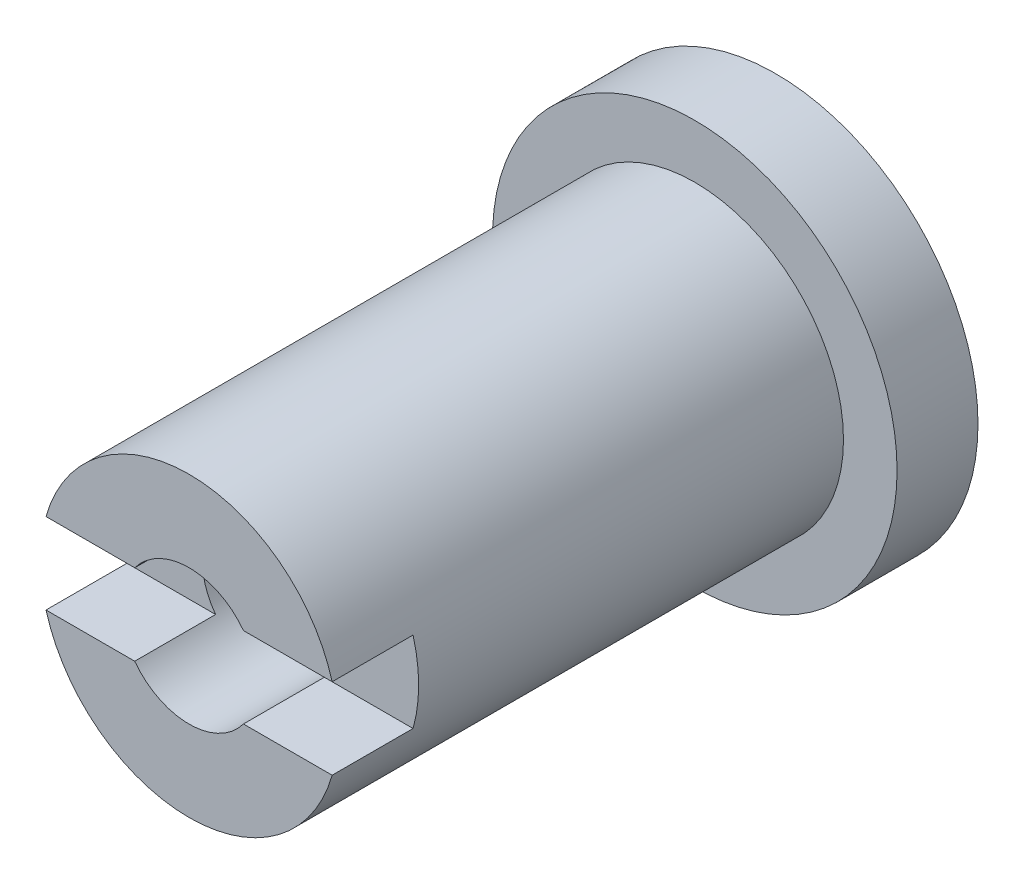
ISO-10303-21;
HEADER;
FILE_DESCRIPTION(('STEP AP214'),'2;1');
FILE_NAME('part.step','',(''),(''),'','','');
FILE_SCHEMA(('AUTOMOTIVE_DESIGN { 1 0 10303 214 1 1 1 1 }'));
ENDSEC;
DATA;
#1=APPLICATION_CONTEXT('core data for automotive mechanical design processes');
#2=APPLICATION_PROTOCOL_DEFINITION('international standard','automotive_design',2000,#1);
#3=PRODUCT_CONTEXT('',#1,'mechanical');
#4=PRODUCT('Part','Part','',(#3));
#5=PRODUCT_RELATED_PRODUCT_CATEGORY('part','',(#4));
#6=PRODUCT_DEFINITION_FORMATION('','',#4);
#7=PRODUCT_DEFINITION_CONTEXT('part definition',#1,'design');
#8=PRODUCT_DEFINITION('design','',#6,#7);
#9=PRODUCT_DEFINITION_SHAPE('','',#8);
#10=(LENGTH_UNIT() NAMED_UNIT(*) SI_UNIT(.MILLI.,.METRE.));
#11=(NAMED_UNIT(*) PLANE_ANGLE_UNIT() SI_UNIT($,.RADIAN.));
#12=(NAMED_UNIT(*) SI_UNIT($,.STERADIAN.) SOLID_ANGLE_UNIT());
#13=UNCERTAINTY_MEASURE_WITH_UNIT(LENGTH_MEASURE(1.E-05),#10,'distance_accuracy_value','');
#14=(GEOMETRIC_REPRESENTATION_CONTEXT(3) GLOBAL_UNCERTAINTY_ASSIGNED_CONTEXT((#13)) GLOBAL_UNIT_ASSIGNED_CONTEXT((#10,
#11,#12)) REPRESENTATION_CONTEXT('',''));
#15=CARTESIAN_POINT('',(0.,0.,0.));
#16=DIRECTION('',(0.,0.,1.));
#17=DIRECTION('',(1.,0.,0.));
#18=AXIS2_PLACEMENT_3D('',#15,#16,#17);
#19=CARTESIAN_POINT('',(0.,0.,29.));
#20=DIRECTION('',(0.,0.,1.));
#21=DIRECTION('',(1.,0.,0.));
#22=AXIS2_PLACEMENT_3D('',#19,#20,#21);
#23=PLANE('',#22);
#24=DIRECTION('',(1.,0.,0.));
#25=VECTOR('',#24,1.);
#26=CARTESIAN_POINT('',(-7.88726484093672,-2.,29.));
#27=LINE('',#26,#25);
#28=CARTESIAN_POINT('',(-7.072658623177,-2.,29.));
#29=VERTEX_POINT('',#28);
#30=CARTESIAN_POINT('',(-2.68747093007534,-2.,29.));
#31=VERTEX_POINT('',#30);
#32=EDGE_CURVE('E186',#29,#31,#27,.T.);
#33=ORIENTED_EDGE('',*,*,#32,.F.);
#34=CARTESIAN_POINT('',(0.,0.,29.));
#35=DIRECTION('',(0.,0.,1.));
#36=DIRECTION('',(1.,0.,0.));
#37=AXIS2_PLACEMENT_3D('',#34,#35,#36);
#38=CIRCLE('',#37,7.35);
#39=CARTESIAN_POINT('',(7.072658623177,-2.,29.));
#40=VERTEX_POINT('',#39);
#41=EDGE_CURVE('E144',#29,#40,#38,.T.);
#42=ORIENTED_EDGE('',*,*,#41,.T.);
#43=CARTESIAN_POINT('',(2.68747093007534,-2.,29.));
#44=VERTEX_POINT('',#43);
#45=EDGE_CURVE('E135',#44,#40,#27,.T.);
#46=ORIENTED_EDGE('',*,*,#45,.F.);
#47=CARTESIAN_POINT('',(0.,0.,29.));
#48=DIRECTION('',(0.,0.,1.));
#49=DIRECTION('',(1.,0.,0.));
#50=AXIS2_PLACEMENT_3D('',#47,#48,#49);
#51=CIRCLE('',#50,3.35);
#52=EDGE_CURVE('E201',#31,#44,#51,.T.);
#53=ORIENTED_EDGE('',*,*,#52,.F.);
#54=EDGE_LOOP('',(#33,#42,#46,#53));
#55=FACE_BOUND('',#54,.T.);
#56=ADVANCED_FACE('F53',(#55),#23,.T.);
#57=CARTESIAN_POINT('',(0.,0.,4.));
#58=DIRECTION('',(0.,0.,1.));
#59=DIRECTION('',(1.,0.,0.));
#60=AXIS2_PLACEMENT_3D('',#57,#58,#59);
#61=PLANE('',#60);
#62=CARTESIAN_POINT('',(0.,0.,4.));
#63=DIRECTION('',(0.,0.,1.));
#64=DIRECTION('',(1.,0.,0.));
#65=AXIS2_PLACEMENT_3D('',#62,#63,#64);
#66=CIRCLE('',#65,7.35);
#67=CARTESIAN_POINT('',(7.35,0.,4.));
#68=VERTEX_POINT('',#67);
#69=EDGE_CURVE('E150',#68,#68,#66,.T.);
#70=ORIENTED_EDGE('',*,*,#69,.F.);
#71=EDGE_LOOP('',(#70));
#72=FACE_BOUND('',#71,.T.);
#73=CARTESIAN_POINT('',(0.,0.,4.));
#74=DIRECTION('',(0.,0.,1.));
#75=DIRECTION('',(1.,0.,0.));
#76=AXIS2_PLACEMENT_3D('',#73,#74,#75);
#77=CIRCLE('',#76,10.);
#78=CARTESIAN_POINT('',(10.,0.,4.));
#79=VERTEX_POINT('',#78);
#80=EDGE_CURVE('E160',#79,#79,#77,.T.);
#81=ORIENTED_EDGE('',*,*,#80,.T.);
#82=EDGE_LOOP('',(#81));
#83=FACE_BOUND('',#82,.T.);
#84=ADVANCED_FACE('F220',(#72,#83),#61,.T.);
#85=CARTESIAN_POINT('',(0.,0.,0.));
#86=DIRECTION('',(0.,0.,1.));
#87=DIRECTION('',(1.,0.,0.));
#88=AXIS2_PLACEMENT_3D('',#85,#86,#87);
#89=PLANE('',#88);
#90=CARTESIAN_POINT('',(0.,0.,0.));
#91=DIRECTION('',(0.,0.,1.));
#92=DIRECTION('',(1.,0.,0.));
#93=AXIS2_PLACEMENT_3D('',#90,#91,#92);
#94=CIRCLE('',#93,10.);
#95=CARTESIAN_POINT('',(10.,0.,0.));
#96=VERTEX_POINT('',#95);
#97=EDGE_CURVE('E159',#96,#96,#94,.T.);
#98=ORIENTED_EDGE('',*,*,#97,.F.);
#99=EDGE_LOOP('',(#98));
#100=FACE_BOUND('',#99,.T.);
#101=CARTESIAN_POINT('',(0.,0.,0.));
#102=DIRECTION('',(0.,0.,1.));
#103=DIRECTION('',(1.,0.,0.));
#104=AXIS2_PLACEMENT_3D('',#101,#102,#103);
#105=CIRCLE('',#104,4.);
#106=CARTESIAN_POINT('',(4.,0.,0.));
#107=VERTEX_POINT('',#106);
#108=EDGE_CURVE('E147',#107,#107,#105,.T.);
#109=ORIENTED_EDGE('',*,*,#108,.T.);
#110=EDGE_LOOP('',(#109));
#111=FACE_BOUND('',#110,.T.);
#112=ADVANCED_FACE('F227',(#100,#111),#89,.F.);
#113=CARTESIAN_POINT('',(0.,0.,4.));
#114=DIRECTION('',(0.,0.,-1.));
#115=DIRECTION('',(-1.,0.,0.));
#116=AXIS2_PLACEMENT_3D('',#113,#114,#115);
#117=CYLINDRICAL_SURFACE('',#116,10.);
#118=ORIENTED_EDGE('',*,*,#80,.F.);
#119=EDGE_LOOP('',(#118));
#120=FACE_BOUND('',#119,.T.);
#121=ORIENTED_EDGE('',*,*,#97,.T.);
#122=EDGE_LOOP('',(#121));
#123=FACE_BOUND('',#122,.T.);
#124=ADVANCED_FACE('F55',(#120,#123),#117,.T.);
#125=CARTESIAN_POINT('',(0.,0.,4.));
#126=DIRECTION('',(0.,0.,-1.));
#127=DIRECTION('',(-1.,0.,0.));
#128=AXIS2_PLACEMENT_3D('',#125,#126,#127);
#129=CYLINDRICAL_SURFACE('',#128,4.);
#130=CARTESIAN_POINT('',(0.,0.,4.));
#131=DIRECTION('',(0.,0.,1.));
#132=DIRECTION('',(1.,0.,0.));
#133=AXIS2_PLACEMENT_3D('',#130,#131,#132);
#134=CIRCLE('',#133,4.);
#135=CARTESIAN_POINT('',(4.,0.,4.));
#136=VERTEX_POINT('',#135);
#137=EDGE_CURVE('E143',#136,#136,#134,.T.);
#138=ORIENTED_EDGE('',*,*,#137,.T.);
#139=EDGE_LOOP('',(#138));
#140=FACE_BOUND('',#139,.T.);
#141=ORIENTED_EDGE('',*,*,#108,.F.);
#142=EDGE_LOOP('',(#141));
#143=FACE_BOUND('',#142,.T.);
#144=ADVANCED_FACE('F234',(#140,#143),#129,.F.);
#145=CARTESIAN_POINT('',(0.,0.,4.));
#146=DIRECTION('',(0.,0.,1.));
#147=DIRECTION('',(1.,0.,0.));
#148=AXIS2_PLACEMENT_3D('',#145,#146,#147);
#149=PLANE('',#148);
#150=CARTESIAN_POINT('',(0.,0.,4.));
#151=DIRECTION('',(0.,0.,1.));
#152=DIRECTION('',(1.,0.,0.));
#153=AXIS2_PLACEMENT_3D('',#150,#151,#152);
#154=CIRCLE('',#153,3.35);
#155=CARTESIAN_POINT('',(3.35,0.,4.));
#156=VERTEX_POINT('',#155);
#157=EDGE_CURVE('E153',#156,#156,#154,.T.);
#158=ORIENTED_EDGE('',*,*,#157,.T.);
#159=EDGE_LOOP('',(#158));
#160=FACE_BOUND('',#159,.T.);
#161=ORIENTED_EDGE('',*,*,#137,.F.);
#162=EDGE_LOOP('',(#161));
#163=FACE_BOUND('',#162,.T.);
#164=ADVANCED_FACE('F206',(#160,#163),#149,.F.);
#165=DIRECTION('',(-1.,0.,0.));
#166=VECTOR('',#165,1.);
#167=CARTESIAN_POINT('',(-7.88726484093672,2.,29.));
#168=LINE('',#167,#166);
#169=CARTESIAN_POINT('',(7.072658623177,2.,29.));
#170=VERTEX_POINT('',#169);
#171=CARTESIAN_POINT('',(2.68747093007534,2.,29.));
#172=VERTEX_POINT('',#171);
#173=EDGE_CURVE('E119',#170,#172,#168,.T.);
#174=ORIENTED_EDGE('',*,*,#173,.F.);
#175=CARTESIAN_POINT('',(-7.072658623177,2.,29.));
#176=VERTEX_POINT('',#175);
#177=EDGE_CURVE('E132',#170,#176,#38,.T.);
#178=ORIENTED_EDGE('',*,*,#177,.T.);
#179=CARTESIAN_POINT('',(-2.68747093007534,2.,29.));
#180=VERTEX_POINT('',#179);
#181=EDGE_CURVE('E136',#180,#176,#168,.T.);
#182=ORIENTED_EDGE('',*,*,#181,.F.);
#183=EDGE_CURVE('E134',#172,#180,#51,.T.);
#184=ORIENTED_EDGE('',*,*,#183,.F.);
#185=EDGE_LOOP('',(#174,#178,#182,#184));
#186=FACE_BOUND('',#185,.T.);
#187=ADVANCED_FACE('F130',(#186),#23,.T.);
#188=CARTESIAN_POINT('',(0.,0.,29.));
#189=DIRECTION('',(0.,0.,-1.));
#190=DIRECTION('',(-1.,0.,0.));
#191=AXIS2_PLACEMENT_3D('',#188,#189,#190);
#192=CYLINDRICAL_SURFACE('',#191,7.35);
#193=ORIENTED_EDGE('',*,*,#41,.F.);
#194=DIRECTION('',(0.,0.,-1.));
#195=VECTOR('',#194,1.);
#196=CARTESIAN_POINT('',(-7.072658623177,-2.,29.));
#197=LINE('',#196,#195);
#198=CARTESIAN_POINT('',(-7.072658623177,-2.,25.));
#199=VERTEX_POINT('',#198);
#200=EDGE_CURVE('E199',#29,#199,#197,.T.);
#201=ORIENTED_EDGE('',*,*,#200,.T.);
#202=CARTESIAN_POINT('',(0.,0.,25.));
#203=DIRECTION('',(0.,0.,1.));
#204=DIRECTION('',(1.,0.,0.));
#205=AXIS2_PLACEMENT_3D('',#202,#203,#204);
#206=CIRCLE('',#205,7.35);
#207=CARTESIAN_POINT('',(-7.072658623177,2.,25.));
#208=VERTEX_POINT('',#207);
#209=EDGE_CURVE('E195',#208,#199,#206,.T.);
#210=ORIENTED_EDGE('',*,*,#209,.F.);
#211=DIRECTION('',(0.,0.,-1.));
#212=VECTOR('',#211,1.);
#213=CARTESIAN_POINT('',(-7.072658623177,2.,29.));
#214=LINE('',#213,#212);
#215=EDGE_CURVE('E125',#208,#176,#214,.F.);
#216=ORIENTED_EDGE('',*,*,#215,.T.);
#217=ORIENTED_EDGE('',*,*,#177,.F.);
#218=DIRECTION('',(0.,0.,-1.));
#219=VECTOR('',#218,1.);
#220=CARTESIAN_POINT('',(7.072658623177,2.,29.));
#221=LINE('',#220,#219);
#222=CARTESIAN_POINT('',(7.072658623177,2.,25.));
#223=VERTEX_POINT('',#222);
#224=EDGE_CURVE('E116',#170,#223,#221,.T.);
#225=ORIENTED_EDGE('',*,*,#224,.T.);
#226=CARTESIAN_POINT('',(7.072658623177,-2.,25.));
#227=VERTEX_POINT('',#226);
#228=EDGE_CURVE('E193',#227,#223,#206,.T.);
#229=ORIENTED_EDGE('',*,*,#228,.F.);
#230=DIRECTION('',(0.,0.,-1.));
#231=VECTOR('',#230,1.);
#232=CARTESIAN_POINT('',(7.072658623177,-2.,29.));
#233=LINE('',#232,#231);
#234=EDGE_CURVE('E124',#227,#40,#233,.F.);
#235=ORIENTED_EDGE('',*,*,#234,.T.);
#236=EDGE_LOOP('',(#193,#201,#210,#216,#217,#225,#229,#235));
#237=FACE_BOUND('',#236,.T.);
#238=ORIENTED_EDGE('',*,*,#69,.T.);
#239=EDGE_LOOP('',(#238));
#240=FACE_BOUND('',#239,.T.);
#241=ADVANCED_FACE('F140',(#237,#240),#192,.T.);
#242=CARTESIAN_POINT('',(0.,0.,29.));
#243=DIRECTION('',(0.,0.,-1.));
#244=DIRECTION('',(-1.,0.,0.));
#245=AXIS2_PLACEMENT_3D('',#242,#243,#244);
#246=CYLINDRICAL_SURFACE('',#245,3.35);
#247=DIRECTION('',(0.,0.,-1.));
#248=VECTOR('',#247,1.);
#249=CARTESIAN_POINT('',(-2.68747093007534,-2.,29.));
#250=LINE('',#249,#248);
#251=CARTESIAN_POINT('',(-2.68747093007534,-2.,25.));
#252=VERTEX_POINT('',#251);
#253=EDGE_CURVE('E12',#31,#252,#250,.T.);
#254=ORIENTED_EDGE('',*,*,#253,.F.);
#255=ORIENTED_EDGE('',*,*,#52,.T.);
#256=DIRECTION('',(0.,0.,-1.));
#257=VECTOR('',#256,1.);
#258=CARTESIAN_POINT('',(2.68747093007534,-2.,29.));
#259=LINE('',#258,#257);
#260=CARTESIAN_POINT('',(2.68747093007534,-2.,25.));
#261=VERTEX_POINT('',#260);
#262=EDGE_CURVE('E171',#261,#44,#259,.F.);
#263=ORIENTED_EDGE('',*,*,#262,.F.);
#264=CARTESIAN_POINT('',(0.,0.,25.));
#265=DIRECTION('',(0.,0.,1.));
#266=DIRECTION('',(1.,0.,0.));
#267=AXIS2_PLACEMENT_3D('',#264,#265,#266);
#268=CIRCLE('',#267,3.35);
#269=CARTESIAN_POINT('',(2.68747093007534,2.,25.));
#270=VERTEX_POINT('',#269);
#271=EDGE_CURVE('E163',#261,#270,#268,.T.);
#272=ORIENTED_EDGE('',*,*,#271,.T.);
#273=DIRECTION('',(0.,0.,-1.));
#274=VECTOR('',#273,1.);
#275=CARTESIAN_POINT('',(2.68747093007534,2.,29.));
#276=LINE('',#275,#274);
#277=EDGE_CURVE('E168',#172,#270,#276,.T.);
#278=ORIENTED_EDGE('',*,*,#277,.F.);
#279=ORIENTED_EDGE('',*,*,#183,.T.);
#280=DIRECTION('',(0.,0.,-1.));
#281=VECTOR('',#280,1.);
#282=CARTESIAN_POINT('',(-2.68747093007534,2.,29.));
#283=LINE('',#282,#281);
#284=CARTESIAN_POINT('',(-2.68747093007534,2.,25.));
#285=VERTEX_POINT('',#284);
#286=EDGE_CURVE('E61',#285,#180,#283,.F.);
#287=ORIENTED_EDGE('',*,*,#286,.F.);
#288=EDGE_CURVE('E169',#285,#252,#268,.T.);
#289=ORIENTED_EDGE('',*,*,#288,.T.);
#290=EDGE_LOOP('',(#254,#255,#263,#272,#278,#279,#287,#289));
#291=FACE_BOUND('',#290,.T.);
#292=ORIENTED_EDGE('',*,*,#157,.F.);
#293=EDGE_LOOP('',(#292));
#294=FACE_BOUND('',#293,.T.);
#295=ADVANCED_FACE('F178',(#291,#294),#246,.F.);
#296=CARTESIAN_POINT('',(0.,0.,25.));
#297=DIRECTION('',(0.,0.,1.));
#298=DIRECTION('',(1.,0.,0.));
#299=AXIS2_PLACEMENT_3D('',#296,#297,#298);
#300=PLANE('',#299);
#301=ORIENTED_EDGE('',*,*,#228,.T.);
#302=DIRECTION('',(-1.,0.,0.));
#303=VECTOR('',#302,1.);
#304=CARTESIAN_POINT('',(-7.88726484093672,2.,25.));
#305=LINE('',#304,#303);
#306=EDGE_CURVE('E75',#223,#270,#305,.T.);
#307=ORIENTED_EDGE('',*,*,#306,.T.);
#308=ORIENTED_EDGE('',*,*,#271,.F.);
#309=DIRECTION('',(1.,0.,0.));
#310=VECTOR('',#309,1.);
#311=CARTESIAN_POINT('',(-7.88726484093672,-2.,25.));
#312=LINE('',#311,#310);
#313=EDGE_CURVE('E188',#261,#227,#312,.T.);
#314=ORIENTED_EDGE('',*,*,#313,.T.);
#315=EDGE_LOOP('',(#301,#307,#308,#314));
#316=FACE_BOUND('',#315,.T.);
#317=ADVANCED_FACE('F209',(#316),#300,.T.);
#318=CARTESIAN_POINT('',(-7.88726484093672,2.,25.));
#319=DIRECTION('',(0.,1.,0.));
#320=DIRECTION('',(0.,0.,1.));
#321=AXIS2_PLACEMENT_3D('',#318,#319,#320);
#322=PLANE('',#321);
#323=ORIENTED_EDGE('',*,*,#173,.T.);
#324=ORIENTED_EDGE('',*,*,#277,.T.);
#325=ORIENTED_EDGE('',*,*,#306,.F.);
#326=ORIENTED_EDGE('',*,*,#224,.F.);
#327=EDGE_LOOP('',(#323,#324,#325,#326));
#328=FACE_BOUND('',#327,.T.);
#329=ADVANCED_FACE('F118',(#328),#322,.F.);
#330=CARTESIAN_POINT('',(-7.88726484093672,-2.,25.));
#331=DIRECTION('',(0.,-1.,0.));
#332=DIRECTION('',(0.,0.,-1.));
#333=AXIS2_PLACEMENT_3D('',#330,#331,#332);
#334=PLANE('',#333);
#335=ORIENTED_EDGE('',*,*,#313,.F.);
#336=ORIENTED_EDGE('',*,*,#262,.T.);
#337=ORIENTED_EDGE('',*,*,#45,.T.);
#338=ORIENTED_EDGE('',*,*,#234,.F.);
#339=EDGE_LOOP('',(#335,#336,#337,#338));
#340=FACE_BOUND('',#339,.T.);
#341=ADVANCED_FACE('F306',(#340),#334,.F.);
#342=ORIENTED_EDGE('',*,*,#32,.T.);
#343=ORIENTED_EDGE('',*,*,#253,.T.);
#344=EDGE_CURVE('E68',#199,#252,#312,.T.);
#345=ORIENTED_EDGE('',*,*,#344,.F.);
#346=ORIENTED_EDGE('',*,*,#200,.F.);
#347=EDGE_LOOP('',(#342,#343,#345,#346));
#348=FACE_BOUND('',#347,.T.);
#349=ADVANCED_FACE('F313',(#348),#334,.F.);
#350=EDGE_CURVE('E184',#285,#208,#305,.T.);
#351=ORIENTED_EDGE('',*,*,#350,.F.);
#352=ORIENTED_EDGE('',*,*,#286,.T.);
#353=ORIENTED_EDGE('',*,*,#181,.T.);
#354=ORIENTED_EDGE('',*,*,#215,.F.);
#355=EDGE_LOOP('',(#351,#352,#353,#354));
#356=FACE_BOUND('',#355,.T.);
#357=ADVANCED_FACE('F185',(#356),#322,.F.);
#358=ORIENTED_EDGE('',*,*,#209,.T.);
#359=ORIENTED_EDGE('',*,*,#344,.T.);
#360=ORIENTED_EDGE('',*,*,#288,.F.);
#361=ORIENTED_EDGE('',*,*,#350,.T.);
#362=EDGE_LOOP('',(#358,#359,#360,#361));
#363=FACE_BOUND('',#362,.T.);
#364=ADVANCED_FACE('F183',(#363),#300,.T.);
#365=CLOSED_SHELL('',(#56,#84,#112,#124,#144,#164,#187,#241,#295,#317,#329,#341,#349,#357,#364));
#366=MANIFOLD_SOLID_BREP('B2',#365);
#367=ADVANCED_BREP_SHAPE_REPRESENTATION('',(#18,#366),#14);
#368=SHAPE_DEFINITION_REPRESENTATION(#9,#367);
ENDSEC;
END-ISO-10303-21;
